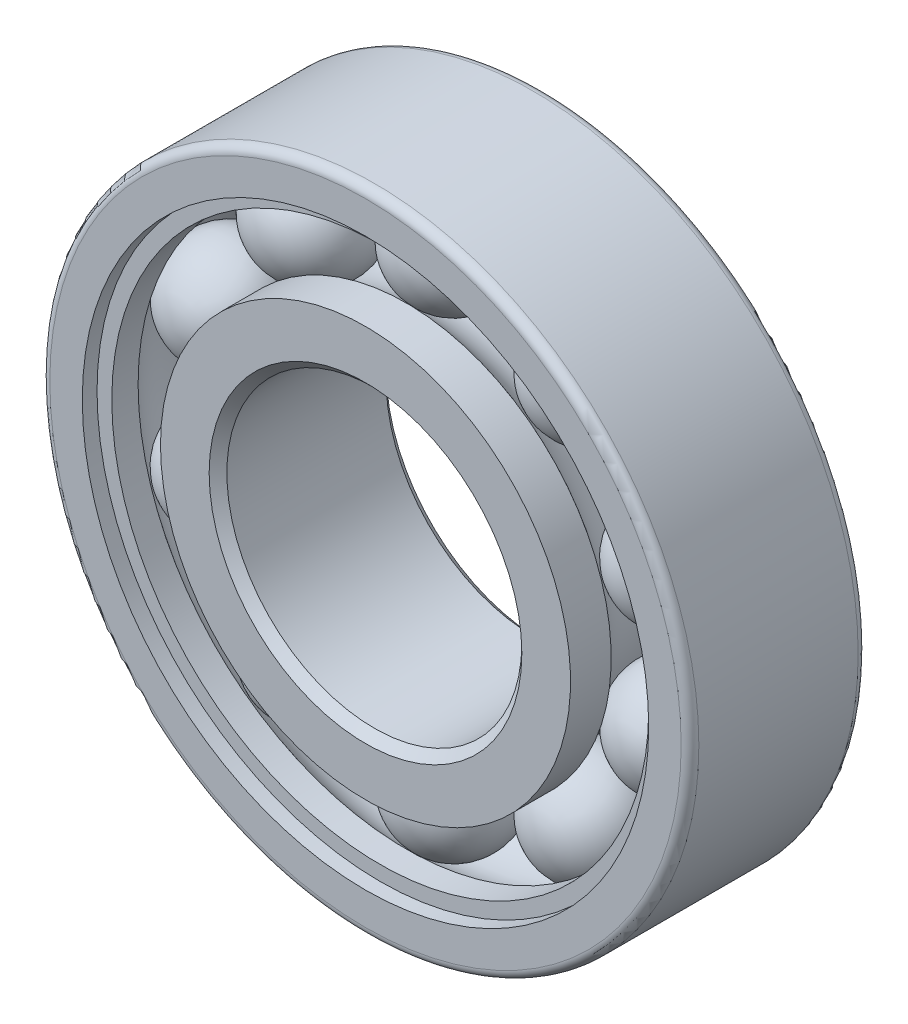
ISO-10303-21;
HEADER;
FILE_DESCRIPTION(('STEP AP214'),'2;1');
FILE_NAME('part.step','',(''),(''),'','','');
FILE_SCHEMA(('AUTOMOTIVE_DESIGN { 1 0 10303 214 1 1 1 1 }'));
ENDSEC;
DATA;
#1=APPLICATION_CONTEXT('core data for automotive mechanical design processes');
#2=APPLICATION_PROTOCOL_DEFINITION('international standard','automotive_design',2000,#1);
#3=PRODUCT_CONTEXT('',#1,'mechanical');
#4=PRODUCT('Part','Part','',(#3));
#5=PRODUCT_RELATED_PRODUCT_CATEGORY('part','',(#4));
#6=PRODUCT_DEFINITION_FORMATION('','',#4);
#7=PRODUCT_DEFINITION_CONTEXT('part definition',#1,'design');
#8=PRODUCT_DEFINITION('design','',#6,#7);
#9=PRODUCT_DEFINITION_SHAPE('','',#8);
#10=(LENGTH_UNIT() NAMED_UNIT(*) SI_UNIT(.MILLI.,.METRE.));
#11=(NAMED_UNIT(*) PLANE_ANGLE_UNIT() SI_UNIT($,.RADIAN.));
#12=(NAMED_UNIT(*) SI_UNIT($,.STERADIAN.) SOLID_ANGLE_UNIT());
#13=UNCERTAINTY_MEASURE_WITH_UNIT(LENGTH_MEASURE(1.E-05),#10,'distance_accuracy_value','');
#14=(GEOMETRIC_REPRESENTATION_CONTEXT(3) GLOBAL_UNCERTAINTY_ASSIGNED_CONTEXT((#13)) GLOBAL_UNIT_ASSIGNED_CONTEXT((#10,
#11,#12)) REPRESENTATION_CONTEXT('',''));
#15=CARTESIAN_POINT('',(0.,0.,0.));
#16=DIRECTION('',(0.,0.,1.));
#17=DIRECTION('',(1.,0.,0.));
#18=AXIS2_PLACEMENT_3D('',#15,#16,#17);
#19=CARTESIAN_POINT('',(-4.70815987086262,6.48022612494339,0.));
#20=DIRECTION('',(0.,0.,1.));
#21=DIRECTION('',(-0.587785252292462,0.809016994374955,0.));
#22=AXIS2_PLACEMENT_3D('',#19,#20,#21);
#23=SPHERICAL_SURFACE('',#22,1.9);
#24=CARTESIAN_POINT('',(-4.70815987086262,6.48022612494339,1.9));
#25=VERTEX_POINT('',#24);
#26=VERTEX_LOOP('',#25);
#27=FACE_BOUND('',#26,.T.);
#28=ADVANCED_FACE('F37',(#27),#23,.T.);
#29=CLOSED_SHELL('',(#28));
#30=MANIFOLD_SOLID_BREP('B2',#29);
#31=CARTESIAN_POINT('',(-7.61796269552415,2.47522612494341,0.));
#32=DIRECTION('',(0.,0.,1.));
#33=DIRECTION('',(-0.95105651629515,0.309016994374958,0.));
#34=AXIS2_PLACEMENT_3D('',#31,#32,#33);
#35=SPHERICAL_SURFACE('',#34,1.9);
#36=CARTESIAN_POINT('',(-7.61796269552415,2.47522612494341,1.9));
#37=VERTEX_POINT('',#36);
#38=VERTEX_LOOP('',#37);
#39=FACE_BOUND('',#38,.T.);
#40=ADVANCED_FACE('F55',(#39),#35,.T.);
#41=CLOSED_SHELL('',(#40));
#42=MANIFOLD_SOLID_BREP('B6',#41);
#43=CARTESIAN_POINT('',(-7.6179626955242,-2.47522612494326,0.));
#44=DIRECTION('',(0.,0.,1.));
#45=DIRECTION('',(-0.951056516295157,-0.309016994374938,0.));
#46=AXIS2_PLACEMENT_3D('',#43,#44,#45);
#47=SPHERICAL_SURFACE('',#46,1.9);
#48=CARTESIAN_POINT('',(-7.6179626955242,-2.47522612494326,1.9));
#49=VERTEX_POINT('',#48);
#50=VERTEX_LOOP('',#49);
#51=FACE_BOUND('',#50,.T.);
#52=ADVANCED_FACE('F73',(#51),#47,.T.);
#53=CLOSED_SHELL('',(#52));
#54=MANIFOLD_SOLID_BREP('B33',#53);
#55=CARTESIAN_POINT('',(-4.70815987086277,-6.48022612494329,0.));
#56=DIRECTION('',(0.,0.,1.));
#57=DIRECTION('',(-0.58778525229248,-0.809016994374942,0.));
#58=AXIS2_PLACEMENT_3D('',#55,#56,#57);
#59=SPHERICAL_SURFACE('',#58,1.9);
#60=CARTESIAN_POINT('',(-4.70815987086277,-6.48022612494329,1.9));
#61=VERTEX_POINT('',#60);
#62=VERTEX_LOOP('',#61);
#63=FACE_BOUND('',#62,.T.);
#64=ADVANCED_FACE('F91',(#63),#59,.T.);
#65=CLOSED_SHELL('',(#64));
#66=MANIFOLD_SOLID_BREP('B51',#65);
#67=CARTESIAN_POINT('',(0.,-8.01,0.));
#68=DIRECTION('',(0.,0.,1.));
#69=DIRECTION('',(0.,-1.,0.));
#70=AXIS2_PLACEMENT_3D('',#67,#68,#69);
#71=SPHERICAL_SURFACE('',#70,1.9);
#72=CARTESIAN_POINT('',(0.,-8.01,1.9));
#73=VERTEX_POINT('',#72);
#74=VERTEX_LOOP('',#73);
#75=FACE_BOUND('',#74,.T.);
#76=ADVANCED_FACE('F109',(#75),#71,.T.);
#77=CLOSED_SHELL('',(#76));
#78=MANIFOLD_SOLID_BREP('B69',#77);
#79=CARTESIAN_POINT('',(4.70815987086267,-6.48022612494336,0.));
#80=DIRECTION('',(0.,0.,1.));
#81=DIRECTION('',(0.587785252292469,-0.809016994374951,0.));
#82=AXIS2_PLACEMENT_3D('',#79,#80,#81);
#83=SPHERICAL_SURFACE('',#82,1.9);
#84=CARTESIAN_POINT('',(4.70815987086267,-6.48022612494336,1.9));
#85=VERTEX_POINT('',#84);
#86=VERTEX_LOOP('',#85);
#87=FACE_BOUND('',#86,.T.);
#88=ADVANCED_FACE('F127',(#87),#83,.T.);
#89=CLOSED_SHELL('',(#88));
#90=MANIFOLD_SOLID_BREP('B87',#89);
#91=CARTESIAN_POINT('',(7.61796269552417,-2.47522612494336,0.));
#92=DIRECTION('',(0.,0.,1.));
#93=DIRECTION('',(0.951056516295152,-0.309016994374952,0.));
#94=AXIS2_PLACEMENT_3D('',#91,#92,#93);
#95=SPHERICAL_SURFACE('',#94,1.9);
#96=CARTESIAN_POINT('',(7.61796269552417,-2.47522612494336,1.9));
#97=VERTEX_POINT('',#96);
#98=VERTEX_LOOP('',#97);
#99=FACE_BOUND('',#98,.T.);
#100=ADVANCED_FACE('F145',(#99),#95,.T.);
#101=CLOSED_SHELL('',(#100));
#102=MANIFOLD_SOLID_BREP('B105',#101);
#103=CARTESIAN_POINT('',(7.61796269552419,2.47522612494331,0.));
#104=DIRECTION('',(0.,0.,1.));
#105=DIRECTION('',(0.951056516295155,0.309016994374945,0.));
#106=AXIS2_PLACEMENT_3D('',#103,#104,#105);
#107=SPHERICAL_SURFACE('',#106,1.9);
#108=CARTESIAN_POINT('',(7.61796269552419,2.47522612494331,1.9));
#109=VERTEX_POINT('',#108);
#110=VERTEX_LOOP('',#109);
#111=FACE_BOUND('',#110,.T.);
#112=ADVANCED_FACE('F163',(#111),#107,.T.);
#113=CLOSED_SHELL('',(#112));
#114=MANIFOLD_SOLID_BREP('B123',#113);
#115=CARTESIAN_POINT('',(4.70815987086272,6.48022612494332,0.));
#116=DIRECTION('',(0.,0.,1.));
#117=DIRECTION('',(0.587785252292474,0.809016994374947,0.));
#118=AXIS2_PLACEMENT_3D('',#115,#116,#117);
#119=SPHERICAL_SURFACE('',#118,1.9);
#120=CARTESIAN_POINT('',(4.70815987086272,6.48022612494332,1.9));
#121=VERTEX_POINT('',#120);
#122=VERTEX_LOOP('',#121);
#123=FACE_BOUND('',#122,.T.);
#124=ADVANCED_FACE('F181',(#123),#119,.T.);
#125=CLOSED_SHELL('',(#124));
#126=MANIFOLD_SOLID_BREP('B141',#125);
#127=CARTESIAN_POINT('',(0.,8.01,0.));
#128=DIRECTION('',(0.,0.,1.));
#129=DIRECTION('',(0.,1.,0.));
#130=AXIS2_PLACEMENT_3D('',#127,#128,#129);
#131=SPHERICAL_SURFACE('',#130,1.9);
#132=CARTESIAN_POINT('',(0.,8.01,1.9));
#133=VERTEX_POINT('',#132);
#134=VERTEX_LOOP('',#133);
#135=FACE_BOUND('',#134,.T.);
#136=ADVANCED_FACE('F201',(#135),#131,.T.);
#137=CLOSED_SHELL('',(#136));
#138=MANIFOLD_SOLID_BREP('B159',#137);
#139=CARTESIAN_POINT('',(0.,0.,3.));
#140=DIRECTION('',(0.,0.,1.));
#141=DIRECTION('',(1.,0.,0.));
#142=AXIS2_PLACEMENT_3D('',#139,#140,#141);
#143=PLANE('',#142);
#144=CARTESIAN_POINT('',(0.,0.,3.));
#145=DIRECTION('',(0.,0.,1.));
#146=DIRECTION('',(1.,0.,0.));
#147=AXIS2_PLACEMENT_3D('',#144,#145,#146);
#148=CIRCLE('',#147,10.7);
#149=CARTESIAN_POINT('',(10.7,0.,3.));
#150=VERTEX_POINT('',#149);
#151=EDGE_CURVE('E200',#150,#150,#148,.T.);
#152=ORIENTED_EDGE('',*,*,#151,.T.);
#153=EDGE_LOOP('',(#152));
#154=FACE_BOUND('',#153,.T.);
#155=CARTESIAN_POINT('',(0.,0.,3.));
#156=DIRECTION('',(0.,0.,-1.));
#157=DIRECTION('',(-1.,0.,0.));
#158=AXIS2_PLACEMENT_3D('',#155,#156,#157);
#159=CIRCLE('',#158,9.6);
#160=CARTESIAN_POINT('',(-9.6,0.,3.));
#161=VERTEX_POINT('',#160);
#162=EDGE_CURVE('E256',#161,#161,#159,.T.);
#163=ORIENTED_EDGE('',*,*,#162,.T.);
#164=EDGE_LOOP('',(#163));
#165=FACE_BOUND('',#164,.T.);
#166=ADVANCED_FACE('F220',(#154,#165),#143,.T.);
#167=CARTESIAN_POINT('',(0.,0.,0.));
#168=DIRECTION('',(0.,0.,-1.));
#169=DIRECTION('',(-1.,0.,0.));
#170=AXIS2_PLACEMENT_3D('',#167,#168,#169);
#171=CYLINDRICAL_SURFACE('',#170,9.1);
#172=CARTESIAN_POINT('',(0.,0.,1.60829760071821));
#173=DIRECTION('',(0.,0.,-1.));
#174=DIRECTION('',(-1.,0.,0.));
#175=AXIS2_PLACEMENT_3D('',#172,#173,#174);
#176=CIRCLE('',#175,9.1);
#177=CARTESIAN_POINT('',(-9.1,0.,1.60829760071821));
#178=VERTEX_POINT('',#177);
#179=EDGE_CURVE('E243',#178,#178,#176,.T.);
#180=ORIENTED_EDGE('',*,*,#179,.T.);
#181=EDGE_LOOP('',(#180));
#182=FACE_BOUND('',#181,.T.);
#183=CARTESIAN_POINT('',(0.,0.,2.5));
#184=DIRECTION('',(0.,0.,-1.));
#185=DIRECTION('',(-1.,0.,0.));
#186=AXIS2_PLACEMENT_3D('',#183,#184,#185);
#187=CIRCLE('',#186,9.1);
#188=CARTESIAN_POINT('',(-9.1,0.,2.5));
#189=VERTEX_POINT('',#188);
#190=EDGE_CURVE('E259',#189,#189,#187,.T.);
#191=ORIENTED_EDGE('',*,*,#190,.F.);
#192=EDGE_LOOP('',(#191));
#193=FACE_BOUND('',#192,.T.);
#194=ADVANCED_FACE('F267',(#182,#193),#171,.F.);
#195=CARTESIAN_POINT('',(0.,0.,-1.60829760071821));
#196=DIRECTION('',(0.,0.,-1.));
#197=DIRECTION('',(-1.,0.,0.));
#198=AXIS2_PLACEMENT_3D('',#195,#196,#197);
#199=CIRCLE('',#198,9.1);
#200=CARTESIAN_POINT('',(-9.1,0.,-1.60829760071821));
#201=VERTEX_POINT('',#200);
#202=EDGE_CURVE('E240',#201,#201,#199,.T.);
#203=ORIENTED_EDGE('',*,*,#202,.F.);
#204=EDGE_LOOP('',(#203));
#205=FACE_BOUND('',#204,.T.);
#206=CARTESIAN_POINT('',(0.,0.,-2.5));
#207=DIRECTION('',(0.,0.,-1.));
#208=DIRECTION('',(-1.,0.,0.));
#209=AXIS2_PLACEMENT_3D('',#206,#207,#208);
#210=CIRCLE('',#209,9.1);
#211=CARTESIAN_POINT('',(-9.1,0.,-2.5));
#212=VERTEX_POINT('',#211);
#213=EDGE_CURVE('E250',#212,#212,#210,.T.);
#214=ORIENTED_EDGE('',*,*,#213,.T.);
#215=EDGE_LOOP('',(#214));
#216=FACE_BOUND('',#215,.T.);
#217=ADVANCED_FACE('F269',(#205,#216),#171,.F.);
#218=CARTESIAN_POINT('',(0.,0.,0.));
#219=DIRECTION('',(0.,0.,-1.));
#220=DIRECTION('',(-1.,0.,0.));
#221=AXIS2_PLACEMENT_3D('',#218,#219,#220);
#222=TOROIDAL_SURFACE('',#221,8.01496950622493,1.94008049959215);
#223=ORIENTED_EDGE('',*,*,#179,.F.);
#224=EDGE_LOOP('',(#223));
#225=FACE_BOUND('',#224,.T.);
#226=ORIENTED_EDGE('',*,*,#202,.T.);
#227=EDGE_LOOP('',(#226));
#228=FACE_BOUND('',#227,.T.);
#229=ADVANCED_FACE('F276',(#225,#228),#222,.F.);
#230=CARTESIAN_POINT('',(0.,0.,-3.));
#231=DIRECTION('',(0.,0.,1.));
#232=DIRECTION('',(1.,0.,0.));
#233=AXIS2_PLACEMENT_3D('',#230,#231,#232);
#234=PLANE('',#233);
#235=CARTESIAN_POINT('',(0.,0.,-3.));
#236=DIRECTION('',(0.,0.,1.));
#237=DIRECTION('',(1.,0.,0.));
#238=AXIS2_PLACEMENT_3D('',#235,#236,#237);
#239=CIRCLE('',#238,10.7);
#240=CARTESIAN_POINT('',(10.7,0.,-3.));
#241=VERTEX_POINT('',#240);
#242=EDGE_CURVE('E235',#241,#241,#239,.F.);
#243=ORIENTED_EDGE('',*,*,#242,.T.);
#244=EDGE_LOOP('',(#243));
#245=FACE_BOUND('',#244,.T.);
#246=CARTESIAN_POINT('',(0.,0.,-3.));
#247=DIRECTION('',(0.,0.,-1.));
#248=DIRECTION('',(-1.,0.,0.));
#249=AXIS2_PLACEMENT_3D('',#246,#247,#248);
#250=CIRCLE('',#249,9.6);
#251=CARTESIAN_POINT('',(-9.6,0.,-3.));
#252=VERTEX_POINT('',#251);
#253=EDGE_CURVE('E247',#252,#252,#250,.T.);
#254=ORIENTED_EDGE('',*,*,#253,.F.);
#255=EDGE_LOOP('',(#254));
#256=FACE_BOUND('',#255,.T.);
#257=ADVANCED_FACE('F286',(#245,#256),#234,.F.);
#258=CARTESIAN_POINT('',(0.,0.,0.));
#259=DIRECTION('',(0.,0.,-1.));
#260=DIRECTION('',(-1.,0.,0.));
#261=AXIS2_PLACEMENT_3D('',#258,#259,#260);
#262=CYLINDRICAL_SURFACE('',#261,11.);
#263=CARTESIAN_POINT('',(0.,0.,-2.7));
#264=DIRECTION('',(0.,0.,1.));
#265=DIRECTION('',(1.,0.,0.));
#266=AXIS2_PLACEMENT_3D('',#263,#264,#265);
#267=CIRCLE('',#266,11.);
#268=CARTESIAN_POINT('',(11.,0.,-2.7));
#269=VERTEX_POINT('',#268);
#270=EDGE_CURVE('E227',#269,#269,#267,.T.);
#271=ORIENTED_EDGE('',*,*,#270,.T.);
#272=EDGE_LOOP('',(#271));
#273=FACE_BOUND('',#272,.T.);
#274=CARTESIAN_POINT('',(0.,0.,2.7));
#275=DIRECTION('',(0.,0.,1.));
#276=DIRECTION('',(1.,0.,0.));
#277=AXIS2_PLACEMENT_3D('',#274,#275,#276);
#278=CIRCLE('',#277,11.);
#279=CARTESIAN_POINT('',(11.,0.,2.7));
#280=VERTEX_POINT('',#279);
#281=EDGE_CURVE('E231',#280,#280,#278,.F.);
#282=ORIENTED_EDGE('',*,*,#281,.T.);
#283=EDGE_LOOP('',(#282));
#284=FACE_BOUND('',#283,.T.);
#285=ADVANCED_FACE('F283',(#273,#284),#262,.T.);
#286=CARTESIAN_POINT('',(0.,0.,-2.5));
#287=DIRECTION('',(0.,0.,-1.));
#288=DIRECTION('',(-1.,0.,0.));
#289=AXIS2_PLACEMENT_3D('',#286,#287,#288);
#290=CYLINDRICAL_SURFACE('',#289,9.6);
#291=CARTESIAN_POINT('',(0.,0.,-2.5));
#292=DIRECTION('',(0.,0.,-1.));
#293=DIRECTION('',(-1.,0.,0.));
#294=AXIS2_PLACEMENT_3D('',#291,#292,#293);
#295=CIRCLE('',#294,9.6);
#296=CARTESIAN_POINT('',(-9.6,0.,-2.5));
#297=VERTEX_POINT('',#296);
#298=EDGE_CURVE('E246',#297,#297,#295,.T.);
#299=ORIENTED_EDGE('',*,*,#298,.F.);
#300=EDGE_LOOP('',(#299));
#301=FACE_BOUND('',#300,.T.);
#302=ORIENTED_EDGE('',*,*,#253,.T.);
#303=EDGE_LOOP('',(#302));
#304=FACE_BOUND('',#303,.T.);
#305=ADVANCED_FACE('F280',(#301,#304),#290,.F.);
#306=CARTESIAN_POINT('',(0.,0.,-2.5));
#307=DIRECTION('',(0.,0.,-1.));
#308=DIRECTION('',(-1.,0.,0.));
#309=AXIS2_PLACEMENT_3D('',#306,#307,#308);
#310=PLANE('',#309);
#311=ORIENTED_EDGE('',*,*,#213,.F.);
#312=EDGE_LOOP('',(#311));
#313=FACE_BOUND('',#312,.T.);
#314=ORIENTED_EDGE('',*,*,#298,.T.);
#315=EDGE_LOOP('',(#314));
#316=FACE_BOUND('',#315,.T.);
#317=ADVANCED_FACE('F309',(#313,#316),#310,.T.);
#318=CARTESIAN_POINT('',(0.,0.,2.5));
#319=DIRECTION('',(0.,0.,1.));
#320=DIRECTION('',(-1.,0.,0.));
#321=AXIS2_PLACEMENT_3D('',#318,#319,#320);
#322=PLANE('',#321);
#323=CARTESIAN_POINT('',(0.,0.,2.5));
#324=DIRECTION('',(0.,0.,-1.));
#325=DIRECTION('',(-1.,0.,0.));
#326=AXIS2_PLACEMENT_3D('',#323,#324,#325);
#327=CIRCLE('',#326,9.6);
#328=CARTESIAN_POINT('',(-9.6,0.,2.5));
#329=VERTEX_POINT('',#328);
#330=EDGE_CURVE('E255',#329,#329,#327,.T.);
#331=ORIENTED_EDGE('',*,*,#330,.F.);
#332=EDGE_LOOP('',(#331));
#333=FACE_BOUND('',#332,.T.);
#334=ORIENTED_EDGE('',*,*,#190,.T.);
#335=EDGE_LOOP('',(#334));
#336=FACE_BOUND('',#335,.T.);
#337=ADVANCED_FACE('F265',(#333,#336),#322,.T.);
#338=CARTESIAN_POINT('',(0.,0.,2.5));
#339=DIRECTION('',(0.,0.,1.));
#340=DIRECTION('',(1.,0.,0.));
#341=AXIS2_PLACEMENT_3D('',#338,#339,#340);
#342=CYLINDRICAL_SURFACE('',#341,9.6);
#343=ORIENTED_EDGE('',*,*,#330,.T.);
#344=EDGE_LOOP('',(#343));
#345=FACE_BOUND('',#344,.T.);
#346=ORIENTED_EDGE('',*,*,#162,.F.);
#347=EDGE_LOOP('',(#346));
#348=FACE_BOUND('',#347,.T.);
#349=ADVANCED_FACE('F294',(#345,#348),#342,.F.);
#350=CARTESIAN_POINT('',(0.,0.,-2.7));
#351=DIRECTION('',(0.,0.,1.));
#352=DIRECTION('',(1.,0.,0.));
#353=AXIS2_PLACEMENT_3D('',#350,#351,#352);
#354=TOROIDAL_SURFACE('',#353,10.7,0.3);
#355=ORIENTED_EDGE('',*,*,#270,.F.);
#356=EDGE_LOOP('',(#355));
#357=FACE_BOUND('',#356,.T.);
#358=ORIENTED_EDGE('',*,*,#242,.F.);
#359=EDGE_LOOP('',(#358));
#360=FACE_BOUND('',#359,.T.);
#361=ADVANCED_FACE('F292',(#357,#360),#354,.T.);
#362=CARTESIAN_POINT('',(0.,0.,2.7));
#363=DIRECTION('',(0.,0.,1.));
#364=DIRECTION('',(1.,0.,0.));
#365=AXIS2_PLACEMENT_3D('',#362,#363,#364);
#366=TOROIDAL_SURFACE('',#365,10.7,0.3);
#367=ORIENTED_EDGE('',*,*,#151,.F.);
#368=EDGE_LOOP('',(#367));
#369=FACE_BOUND('',#368,.T.);
#370=ORIENTED_EDGE('',*,*,#281,.F.);
#371=EDGE_LOOP('',(#370));
#372=FACE_BOUND('',#371,.T.);
#373=ADVANCED_FACE('F222',(#369,#372),#366,.T.);
#374=CLOSED_SHELL('',(#166,#194,#217,#229,#257,#285,#305,#317,#337,#349,#361,#373));
#375=MANIFOLD_SOLID_BREP('B177',#374);
#376=CARTESIAN_POINT('',(0.,0.,0.));
#377=DIRECTION('',(0.,0.,-1.));
#378=DIRECTION('',(-1.,0.,0.));
#379=AXIS2_PLACEMENT_3D('',#376,#377,#378);
#380=TOROIDAL_SURFACE('',#379,8.01496950622493,1.94008049959215);
#381=CARTESIAN_POINT('',(0.,0.,-1.62165110171972));
#382=DIRECTION('',(0.,0.,-1.));
#383=DIRECTION('',(-1.,0.,0.));
#384=AXIS2_PLACEMENT_3D('',#381,#382,#383);
#385=CIRCLE('',#384,6.95);
#386=CARTESIAN_POINT('',(-6.95,0.,-1.62165110171972));
#387=VERTEX_POINT('',#386);
#388=EDGE_CURVE('E429',#387,#387,#385,.T.);
#389=ORIENTED_EDGE('',*,*,#388,.F.);
#390=EDGE_LOOP('',(#389));
#391=FACE_BOUND('',#390,.T.);
#392=CARTESIAN_POINT('',(0.,0.,1.62165110171972));
#393=DIRECTION('',(0.,0.,-1.));
#394=DIRECTION('',(-1.,0.,0.));
#395=AXIS2_PLACEMENT_3D('',#392,#393,#394);
#396=CIRCLE('',#395,6.95);
#397=CARTESIAN_POINT('',(-6.95,0.,1.62165110171972));
#398=VERTEX_POINT('',#397);
#399=EDGE_CURVE('E420',#398,#398,#396,.T.);
#400=ORIENTED_EDGE('',*,*,#399,.T.);
#401=EDGE_LOOP('',(#400));
#402=FACE_BOUND('',#401,.T.);
#403=ADVANCED_FACE('F400',(#391,#402),#380,.F.);
#404=CARTESIAN_POINT('',(0.,0.,0.));
#405=DIRECTION('',(0.,0.,-1.));
#406=DIRECTION('',(-1.,0.,0.));
#407=AXIS2_PLACEMENT_3D('',#404,#405,#406);
#408=CYLINDRICAL_SURFACE('',#407,6.95);
#409=CARTESIAN_POINT('',(0.,0.,3.));
#410=DIRECTION('',(0.,0.,-1.));
#411=DIRECTION('',(-1.,0.,0.));
#412=AXIS2_PLACEMENT_3D('',#409,#410,#411);
#413=CIRCLE('',#412,6.95);
#414=CARTESIAN_POINT('',(-6.95,0.,3.));
#415=VERTEX_POINT('',#414);
#416=EDGE_CURVE('E423',#415,#415,#413,.T.);
#417=ORIENTED_EDGE('',*,*,#416,.T.);
#418=EDGE_LOOP('',(#417));
#419=FACE_BOUND('',#418,.T.);
#420=ORIENTED_EDGE('',*,*,#399,.F.);
#421=EDGE_LOOP('',(#420));
#422=FACE_BOUND('',#421,.T.);
#423=ADVANCED_FACE('F438',(#419,#422),#408,.T.);
#424=CARTESIAN_POINT('',(0.,0.,3.));
#425=DIRECTION('',(0.,0.,1.));
#426=DIRECTION('',(1.,0.,0.));
#427=AXIS2_PLACEMENT_3D('',#424,#425,#426);
#428=PLANE('',#427);
#429=CARTESIAN_POINT('',(0.,0.,3.));
#430=DIRECTION('',(0.,0.,1.));
#431=DIRECTION('',(1.,0.,0.));
#432=AXIS2_PLACEMENT_3D('',#429,#430,#431);
#433=CIRCLE('',#432,5.3);
#434=CARTESIAN_POINT('',(5.3,0.,3.));
#435=VERTEX_POINT('',#434);
#436=EDGE_CURVE('E219',#435,#435,#433,.F.);
#437=ORIENTED_EDGE('',*,*,#436,.T.);
#438=EDGE_LOOP('',(#437));
#439=FACE_BOUND('',#438,.T.);
#440=ORIENTED_EDGE('',*,*,#416,.F.);
#441=EDGE_LOOP('',(#440));
#442=FACE_BOUND('',#441,.T.);
#443=ADVANCED_FACE('F443',(#439,#442),#428,.T.);
#444=CARTESIAN_POINT('',(0.,0.,0.));
#445=DIRECTION('',(0.,0.,-1.));
#446=DIRECTION('',(-1.,0.,0.));
#447=AXIS2_PLACEMENT_3D('',#444,#445,#446);
#448=CYLINDRICAL_SURFACE('',#447,5.);
#449=CARTESIAN_POINT('',(0.,0.,-2.7));
#450=DIRECTION('',(0.,0.,1.));
#451=DIRECTION('',(1.,0.,0.));
#452=AXIS2_PLACEMENT_3D('',#449,#450,#451);
#453=CIRCLE('',#452,5.);
#454=CARTESIAN_POINT('',(5.,0.,-2.7));
#455=VERTEX_POINT('',#454);
#456=EDGE_CURVE('E411',#455,#455,#453,.F.);
#457=ORIENTED_EDGE('',*,*,#456,.T.);
#458=EDGE_LOOP('',(#457));
#459=FACE_BOUND('',#458,.T.);
#460=CARTESIAN_POINT('',(0.,0.,2.7));
#461=DIRECTION('',(0.,0.,1.));
#462=DIRECTION('',(1.,0.,0.));
#463=AXIS2_PLACEMENT_3D('',#460,#461,#462);
#464=CIRCLE('',#463,5.);
#465=CARTESIAN_POINT('',(5.,0.,2.7));
#466=VERTEX_POINT('',#465);
#467=EDGE_CURVE('E415',#466,#466,#464,.T.);
#468=ORIENTED_EDGE('',*,*,#467,.T.);
#469=EDGE_LOOP('',(#468));
#470=FACE_BOUND('',#469,.T.);
#471=ADVANCED_FACE('F449',(#459,#470),#448,.F.);
#472=CARTESIAN_POINT('',(0.,0.,-3.));
#473=DIRECTION('',(0.,0.,1.));
#474=DIRECTION('',(1.,0.,0.));
#475=AXIS2_PLACEMENT_3D('',#472,#473,#474);
#476=PLANE('',#475);
#477=CARTESIAN_POINT('',(0.,0.,-3.));
#478=DIRECTION('',(0.,0.,1.));
#479=DIRECTION('',(1.,0.,0.));
#480=AXIS2_PLACEMENT_3D('',#477,#478,#479);
#481=CIRCLE('',#480,5.29999999999999);
#482=CARTESIAN_POINT('',(5.29999999999999,0.,-3.));
#483=VERTEX_POINT('',#482);
#484=EDGE_CURVE('E407',#483,#483,#481,.T.);
#485=ORIENTED_EDGE('',*,*,#484,.T.);
#486=EDGE_LOOP('',(#485));
#487=FACE_BOUND('',#486,.T.);
#488=CARTESIAN_POINT('',(0.,0.,-3.));
#489=DIRECTION('',(0.,0.,-1.));
#490=DIRECTION('',(-1.,0.,0.));
#491=AXIS2_PLACEMENT_3D('',#488,#489,#490);
#492=CIRCLE('',#491,6.95);
#493=CARTESIAN_POINT('',(-6.95,0.,-3.));
#494=VERTEX_POINT('',#493);
#495=EDGE_CURVE('E426',#494,#494,#492,.T.);
#496=ORIENTED_EDGE('',*,*,#495,.T.);
#497=EDGE_LOOP('',(#496));
#498=FACE_BOUND('',#497,.T.);
#499=ADVANCED_FACE('F454',(#487,#498),#476,.F.);
#500=ORIENTED_EDGE('',*,*,#388,.T.);
#501=EDGE_LOOP('',(#500));
#502=FACE_BOUND('',#501,.T.);
#503=ORIENTED_EDGE('',*,*,#495,.F.);
#504=EDGE_LOOP('',(#503));
#505=FACE_BOUND('',#504,.T.);
#506=ADVANCED_FACE('F433',(#502,#505),#408,.T.);
#507=CARTESIAN_POINT('',(0.,0.,-2.7));
#508=DIRECTION('',(0.,0.,-1.));
#509=DIRECTION('',(-1.,0.,0.));
#510=AXIS2_PLACEMENT_3D('',#507,#508,#509);
#511=CONICAL_SURFACE('',#510,5.,0.785398163397444);
#512=ORIENTED_EDGE('',*,*,#484,.F.);
#513=EDGE_LOOP('',(#512));
#514=FACE_BOUND('',#513,.T.);
#515=ORIENTED_EDGE('',*,*,#456,.F.);
#516=EDGE_LOOP('',(#515));
#517=FACE_BOUND('',#516,.T.);
#518=ADVANCED_FACE('F453',(#514,#517),#511,.F.);
#519=CARTESIAN_POINT('',(0.,0.,3.));
#520=DIRECTION('',(0.,0.,1.));
#521=DIRECTION('',(1.,0.,0.));
#522=AXIS2_PLACEMENT_3D('',#519,#520,#521);
#523=CONICAL_SURFACE('',#522,5.3,0.785398163397447);
#524=CARTESIAN_POINT('',(5.,0.,2.7));
#525=CARTESIAN_POINT('',(5.003125,0.,2.703125));
#526=CARTESIAN_POINT('',(5.00625,0.,2.70625));
#527=CARTESIAN_POINT('',(5.0125,0.,2.7125));
#528=CARTESIAN_POINT('',(5.015625,0.,2.715625));
#529=CARTESIAN_POINT('',(5.021875,0.,2.721875));
#530=CARTESIAN_POINT('',(5.025,0.,2.725));
#531=CARTESIAN_POINT('',(5.03125,0.,2.73125));
#532=CARTESIAN_POINT('',(5.034375,0.,2.734375));
#533=CARTESIAN_POINT('',(5.040625,0.,2.740625));
#534=CARTESIAN_POINT('',(5.04375,0.,2.74375));
#535=CARTESIAN_POINT('',(5.05,0.,2.75));
#536=CARTESIAN_POINT('',(5.053125,0.,2.753125));
#537=CARTESIAN_POINT('',(5.059375,0.,2.759375));
#538=CARTESIAN_POINT('',(5.0625,0.,2.7625));
#539=CARTESIAN_POINT('',(5.06875,0.,2.76875));
#540=CARTESIAN_POINT('',(5.071875,0.,2.771875));
#541=CARTESIAN_POINT('',(5.078125,0.,2.778125));
#542=CARTESIAN_POINT('',(5.08125,0.,2.78125));
#543=CARTESIAN_POINT('',(5.0875,0.,2.7875));
#544=CARTESIAN_POINT('',(5.090625,0.,2.790625));
#545=CARTESIAN_POINT('',(5.096875,0.,2.796875));
#546=CARTESIAN_POINT('',(5.1,0.,2.8));
#547=CARTESIAN_POINT('',(5.10625,0.,2.80625));
#548=CARTESIAN_POINT('',(5.109375,0.,2.809375));
#549=CARTESIAN_POINT('',(5.115625,0.,2.815625));
#550=CARTESIAN_POINT('',(5.11875,0.,2.81875));
#551=CARTESIAN_POINT('',(5.125,0.,2.825));
#552=CARTESIAN_POINT('',(5.128125,0.,2.828125));
#553=CARTESIAN_POINT('',(5.134375,0.,2.834375));
#554=CARTESIAN_POINT('',(5.1375,0.,2.8375));
#555=CARTESIAN_POINT('',(5.14375,0.,2.84375));
#556=CARTESIAN_POINT('',(5.146875,0.,2.846875));
#557=CARTESIAN_POINT('',(5.153125,0.,2.853125));
#558=CARTESIAN_POINT('',(5.15625,0.,2.85625));
#559=CARTESIAN_POINT('',(5.1625,0.,2.8625));
#560=CARTESIAN_POINT('',(5.165625,0.,2.865625));
#561=CARTESIAN_POINT('',(5.171875,0.,2.871875));
#562=CARTESIAN_POINT('',(5.175,0.,2.875));
#563=CARTESIAN_POINT('',(5.18125,0.,2.88125));
#564=CARTESIAN_POINT('',(5.184375,0.,2.884375));
#565=CARTESIAN_POINT('',(5.190625,0.,2.890625));
#566=CARTESIAN_POINT('',(5.19375,0.,2.89375));
#567=CARTESIAN_POINT('',(5.2,0.,2.9));
#568=CARTESIAN_POINT('',(5.203125,0.,2.903125));
#569=CARTESIAN_POINT('',(5.209375,0.,2.909375));
#570=CARTESIAN_POINT('',(5.2125,0.,2.9125));
#571=CARTESIAN_POINT('',(5.21875,0.,2.91875));
#572=CARTESIAN_POINT('',(5.221875,0.,2.921875));
#573=CARTESIAN_POINT('',(5.228125,0.,2.928125));
#574=CARTESIAN_POINT('',(5.23125,0.,2.93125));
#575=CARTESIAN_POINT('',(5.2375,0.,2.9375));
#576=CARTESIAN_POINT('',(5.240625,0.,2.940625));
#577=CARTESIAN_POINT('',(5.246875,0.,2.946875));
#578=CARTESIAN_POINT('',(5.25,0.,2.95));
#579=CARTESIAN_POINT('',(5.25625,0.,2.95625));
#580=CARTESIAN_POINT('',(5.259375,0.,2.959375));
#581=CARTESIAN_POINT('',(5.265625,0.,2.965625));
#582=CARTESIAN_POINT('',(5.26875,0.,2.96875));
#583=CARTESIAN_POINT('',(5.275,0.,2.975));
#584=CARTESIAN_POINT('',(5.278125,0.,2.978125));
#585=CARTESIAN_POINT('',(5.284375,0.,2.984375));
#586=CARTESIAN_POINT('',(5.2875,0.,2.9875));
#587=CARTESIAN_POINT('',(5.29375,0.,2.99375));
#588=CARTESIAN_POINT('',(5.296875,0.,2.996875));
#589=CARTESIAN_POINT('',(5.3,0.,3.));
#590=B_SPLINE_CURVE_WITH_KNOTS('',3,(#524,#525,#526,#527,#528,#529,#530,#531,#532,#533,#534,
#535,#536,#537,#538,#539,#540,#541,#542,#543,#544,#545,#546,#547,#548,#549,#550,#551,#552,#553,
#554,#555,#556,#557,#558,#559,#560,#561,#562,#563,#564,#565,#566,#567,#568,#569,#570,#571,#572,
#573,#574,#575,#576,#577,#578,#579,#580,#581,#582,#583,#584,#585,#586,#587,#588,#589),
.UNSPECIFIED.,.F.,.F.,(4,2,2,2,2,2,2,2,2,2,2,2,2,2,2,2,2,2,2,2,2,2,2,2,2,2,2,2,2,2,2,2,4),(0.,
0.0132582521472478,0.0265165042944954,0.0397747564417432,0.0530330085889907,0.0662912607362392,
0.0795495128834867,0.0928077650307343,0.106066017177982,0.11932426932523,0.132582521472478,
0.145840773619726,0.159099025766973,0.172357277914221,0.185615530061469,0.198873782208716,
0.212132034355965,0.225390286503212,0.23864853865046,0.251906790797708,0.265165042944955,
0.278423295092204,0.291681547239451,0.304939799386699,0.318198051533947,0.331456303681194,
0.344714555828443,0.35797280797569,0.371231060122938,0.384489312270185,0.397747564417433,
0.411005816564681,0.424264068711929),.UNSPECIFIED.);
#591=EDGE_CURVE('BSEAM402',#466,#435,#590,.T.);
#592=ORIENTED_EDGE('',*,*,#467,.F.);
#593=ORIENTED_EDGE('',*,*,#436,.F.);
#594=ORIENTED_EDGE('',*,*,#591,.T.);
#595=ORIENTED_EDGE('',*,*,#591,.F.);
#596=EDGE_LOOP('',(#592,#594,#593,#595));
#597=FACE_BOUND('',#596,.T.);
#598=ADVANCED_FACE('F402',(#597),#523,.F.);
#599=CLOSED_SHELL('',(#403,#423,#443,#471,#499,#506,#518,#598));
#600=MANIFOLD_SOLID_BREP('B195',#599);
#601=ADVANCED_BREP_SHAPE_REPRESENTATION('',(#18,#30,#42,#54,#66,#78,#90,#102,#114,#126,#138,
#375,#600),#14);
#602=SHAPE_DEFINITION_REPRESENTATION(#9,#601);
ENDSEC;
END-ISO-10303-21;
